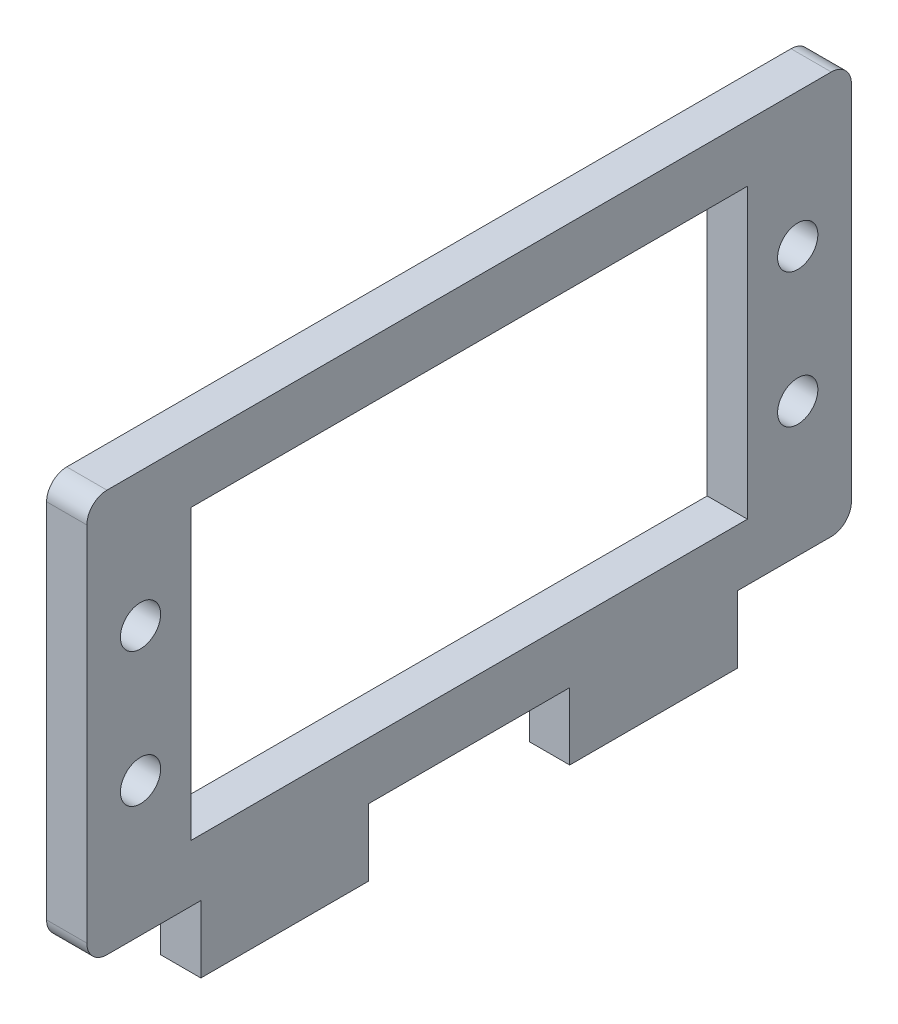
ISO-10303-21;
HEADER;
FILE_DESCRIPTION(('STEP AP214'),'2;1');
FILE_NAME('part.step','',(''),(''),'','','');
FILE_SCHEMA(('AUTOMOTIVE_DESIGN { 1 0 10303 214 1 1 1 1 }'));
ENDSEC;
DATA;
#1=APPLICATION_CONTEXT('core data for automotive mechanical design processes');
#2=APPLICATION_PROTOCOL_DEFINITION('international standard','automotive_design',2000,#1);
#3=PRODUCT_CONTEXT('',#1,'mechanical');
#4=PRODUCT('Part','Part','',(#3));
#5=PRODUCT_RELATED_PRODUCT_CATEGORY('part','',(#4));
#6=PRODUCT_DEFINITION_FORMATION('','',#4);
#7=PRODUCT_DEFINITION_CONTEXT('part definition',#1,'design');
#8=PRODUCT_DEFINITION('design','',#6,#7);
#9=PRODUCT_DEFINITION_SHAPE('','',#8);
#10=(LENGTH_UNIT() NAMED_UNIT(*) SI_UNIT(.MILLI.,.METRE.));
#11=(NAMED_UNIT(*) PLANE_ANGLE_UNIT() SI_UNIT($,.RADIAN.));
#12=(NAMED_UNIT(*) SI_UNIT($,.STERADIAN.) SOLID_ANGLE_UNIT());
#13=UNCERTAINTY_MEASURE_WITH_UNIT(LENGTH_MEASURE(1.E-05),#10,'distance_accuracy_value','');
#14=(GEOMETRIC_REPRESENTATION_CONTEXT(3) GLOBAL_UNCERTAINTY_ASSIGNED_CONTEXT((#13)) GLOBAL_UNIT_ASSIGNED_CONTEXT((#10,
#11,#12)) REPRESENTATION_CONTEXT('',''));
#15=CARTESIAN_POINT('',(0.,0.,0.));
#16=DIRECTION('',(0.,0.,1.));
#17=DIRECTION('',(1.,0.,0.));
#18=AXIS2_PLACEMENT_3D('',#15,#16,#17);
#19=CARTESIAN_POINT('',(3.,0.,0.));
#20=DIRECTION('',(1.,0.,0.));
#21=DIRECTION('',(0.,0.,-1.));
#22=AXIS2_PLACEMENT_3D('',#19,#20,#21);
#23=PLANE('',#22);
#24=CARTESIAN_POINT('',(3.,4.99999999999999,-24.5));
#25=DIRECTION('',(-1.,0.,0.));
#26=DIRECTION('',(0.,0.,1.));
#27=AXIS2_PLACEMENT_3D('',#24,#25,#26);
#28=CIRCLE('',#27,1.5);
#29=CARTESIAN_POINT('',(3.,4.99999999999999,-23.));
#30=VERTEX_POINT('',#29);
#31=EDGE_CURVE('E317',#30,#30,#28,.T.);
#32=ORIENTED_EDGE('',*,*,#31,.T.);
#33=EDGE_LOOP('',(#32));
#34=FACE_BOUND('',#33,.T.);
#35=DIRECTION('',(0.,1.,0.));
#36=VECTOR('',#35,1.);
#37=CARTESIAN_POINT('',(3.,0.,-20.75));
#38=LINE('',#37,#36);
#39=CARTESIAN_POINT('',(3.,10.75,-20.75));
#40=VERTEX_POINT('',#39);
#41=CARTESIAN_POINT('',(3.,-10.75,-20.75));
#42=VERTEX_POINT('',#41);
#43=EDGE_CURVE('E612',#40,#42,#38,.F.);
#44=ORIENTED_EDGE('',*,*,#43,.T.);
#45=DIRECTION('',(0.,0.,1.));
#46=VECTOR('',#45,1.);
#47=CARTESIAN_POINT('',(3.,-10.75,0.));
#48=LINE('',#47,#46);
#49=CARTESIAN_POINT('',(3.,-10.75,20.75));
#50=VERTEX_POINT('',#49);
#51=EDGE_CURVE('E615',#50,#42,#48,.F.);
#52=ORIENTED_EDGE('',*,*,#51,.F.);
#53=DIRECTION('',(0.,1.,0.));
#54=VECTOR('',#53,1.);
#55=CARTESIAN_POINT('',(3.,0.,20.75));
#56=LINE('',#55,#54);
#57=CARTESIAN_POINT('',(3.,10.75,20.75));
#58=VERTEX_POINT('',#57);
#59=EDGE_CURVE('E628',#58,#50,#56,.F.);
#60=ORIENTED_EDGE('',*,*,#59,.F.);
#61=DIRECTION('',(0.,0.,1.));
#62=VECTOR('',#61,1.);
#63=CARTESIAN_POINT('',(3.,10.75,0.));
#64=LINE('',#63,#62);
#65=EDGE_CURVE('E254',#58,#40,#64,.F.);
#66=ORIENTED_EDGE('',*,*,#65,.T.);
#67=EDGE_LOOP('',(#44,#52,#60,#66));
#68=FACE_BOUND('',#67,.T.);
#69=DIRECTION('',(0.,0.,1.));
#70=VECTOR('',#69,1.);
#71=CARTESIAN_POINT('',(3.,15.,0.));
#72=LINE('',#71,#70);
#73=CARTESIAN_POINT('',(3.,15.,27.));
#74=VERTEX_POINT('',#73);
#75=CARTESIAN_POINT('',(3.,15.,-27.));
#76=VERTEX_POINT('',#75);
#77=EDGE_CURVE('E267',#74,#76,#72,.F.);
#78=ORIENTED_EDGE('',*,*,#77,.F.);
#79=CARTESIAN_POINT('',(3.,13.5,27.));
#80=DIRECTION('',(1.,0.,0.));
#81=DIRECTION('',(0.,0.,-1.));
#82=AXIS2_PLACEMENT_3D('',#79,#80,#81);
#83=CIRCLE('',#82,1.5);
#84=CARTESIAN_POINT('',(3.,13.5,28.5));
#85=VERTEX_POINT('',#84);
#86=EDGE_CURVE('E322',#85,#74,#83,.F.);
#87=ORIENTED_EDGE('',*,*,#86,.F.);
#88=DIRECTION('',(0.,1.,0.));
#89=VECTOR('',#88,1.);
#90=CARTESIAN_POINT('',(3.,0.,28.5));
#91=LINE('',#90,#89);
#92=CARTESIAN_POINT('',(3.,-13.5,28.5));
#93=VERTEX_POINT('',#92);
#94=EDGE_CURVE('E262',#85,#93,#91,.F.);
#95=ORIENTED_EDGE('',*,*,#94,.T.);
#96=CARTESIAN_POINT('',(3.,-13.5,27.));
#97=DIRECTION('',(-1.,0.,0.));
#98=DIRECTION('',(0.,0.,1.));
#99=AXIS2_PLACEMENT_3D('',#96,#97,#98);
#100=CIRCLE('',#99,1.5);
#101=CARTESIAN_POINT('',(3.,-15.,27.));
#102=VERTEX_POINT('',#101);
#103=EDGE_CURVE('E265',#102,#93,#100,.T.);
#104=ORIENTED_EDGE('',*,*,#103,.F.);
#105=DIRECTION('',(0.,0.,1.));
#106=VECTOR('',#105,1.);
#107=CARTESIAN_POINT('',(3.,-15.,0.));
#108=LINE('',#107,#106);
#109=CARTESIAN_POINT('',(3.,-15.,20.));
#110=VERTEX_POINT('',#109);
#111=EDGE_CURVE('E251',#102,#110,#108,.F.);
#112=ORIENTED_EDGE('',*,*,#111,.T.);
#113=DIRECTION('',(0.,1.,0.));
#114=VECTOR('',#113,1.);
#115=CARTESIAN_POINT('',(3.,0.,20.));
#116=LINE('',#115,#114);
#117=CARTESIAN_POINT('',(3.,-20.,20.));
#118=VERTEX_POINT('',#117);
#119=EDGE_CURVE('E248',#110,#118,#116,.F.);
#120=ORIENTED_EDGE('',*,*,#119,.T.);
#121=DIRECTION('',(0.,0.,1.));
#122=VECTOR('',#121,1.);
#123=CARTESIAN_POINT('',(3.,-20.,0.));
#124=LINE('',#123,#122);
#125=CARTESIAN_POINT('',(3.,-20.,7.5));
#126=VERTEX_POINT('',#125);
#127=EDGE_CURVE('E247',#118,#126,#124,.F.);
#128=ORIENTED_EDGE('',*,*,#127,.T.);
#129=DIRECTION('',(0.,1.,0.));
#130=VECTOR('',#129,1.);
#131=CARTESIAN_POINT('',(3.,0.,7.49999999999999));
#132=LINE('',#131,#130);
#133=CARTESIAN_POINT('',(3.,-15.,7.49999999999999));
#134=VERTEX_POINT('',#133);
#135=EDGE_CURVE('E236',#134,#126,#132,.F.);
#136=ORIENTED_EDGE('',*,*,#135,.F.);
#137=DIRECTION('',(0.,0.,1.));
#138=VECTOR('',#137,1.);
#139=CARTESIAN_POINT('',(3.,-15.,0.));
#140=LINE('',#139,#138);
#141=CARTESIAN_POINT('',(3.,-15.,-7.5));
#142=VERTEX_POINT('',#141);
#143=EDGE_CURVE('E216',#134,#142,#140,.F.);
#144=ORIENTED_EDGE('',*,*,#143,.T.);
#145=DIRECTION('',(0.,1.,0.));
#146=VECTOR('',#145,1.);
#147=CARTESIAN_POINT('',(3.,0.,-7.49999999999999));
#148=LINE('',#147,#146);
#149=CARTESIAN_POINT('',(3.,-20.,-7.5));
#150=VERTEX_POINT('',#149);
#151=EDGE_CURVE('E215',#142,#150,#148,.F.);
#152=ORIENTED_EDGE('',*,*,#151,.T.);
#153=DIRECTION('',(0.,0.,-1.));
#154=VECTOR('',#153,1.);
#155=CARTESIAN_POINT('',(3.,-20.,0.));
#156=LINE('',#155,#154);
#157=CARTESIAN_POINT('',(3.,-20.,-20.));
#158=VERTEX_POINT('',#157);
#159=EDGE_CURVE('E204',#158,#150,#156,.F.);
#160=ORIENTED_EDGE('',*,*,#159,.F.);
#161=DIRECTION('',(0.,1.,0.));
#162=VECTOR('',#161,1.);
#163=CARTESIAN_POINT('',(3.,0.,-20.));
#164=LINE('',#163,#162);
#165=CARTESIAN_POINT('',(3.,-15.,-20.));
#166=VERTEX_POINT('',#165);
#167=EDGE_CURVE('E171',#166,#158,#164,.F.);
#168=ORIENTED_EDGE('',*,*,#167,.F.);
#169=DIRECTION('',(0.,0.,-1.));
#170=VECTOR('',#169,1.);
#171=CARTESIAN_POINT('',(3.,-15.,0.));
#172=LINE('',#171,#170);
#173=CARTESIAN_POINT('',(3.,-15.,-27.));
#174=VERTEX_POINT('',#173);
#175=EDGE_CURVE('E167',#174,#166,#172,.F.);
#176=ORIENTED_EDGE('',*,*,#175,.F.);
#177=CARTESIAN_POINT('',(3.,-13.5,-27.));
#178=DIRECTION('',(-1.,0.,0.));
#179=DIRECTION('',(0.,0.,1.));
#180=AXIS2_PLACEMENT_3D('',#177,#178,#179);
#181=CIRCLE('',#180,1.5);
#182=CARTESIAN_POINT('',(3.,-13.5,-28.5));
#183=VERTEX_POINT('',#182);
#184=EDGE_CURVE('E155',#183,#174,#181,.T.);
#185=ORIENTED_EDGE('',*,*,#184,.F.);
#186=DIRECTION('',(0.,1.,0.));
#187=VECTOR('',#186,1.);
#188=CARTESIAN_POINT('',(3.,0.,-28.5));
#189=LINE('',#188,#187);
#190=CARTESIAN_POINT('',(3.,13.5,-28.5));
#191=VERTEX_POINT('',#190);
#192=EDGE_CURVE('E150',#191,#183,#189,.F.);
#193=ORIENTED_EDGE('',*,*,#192,.F.);
#194=CARTESIAN_POINT('',(3.,13.5,-27.));
#195=DIRECTION('',(-1.,0.,0.));
#196=DIRECTION('',(0.,0.,1.));
#197=AXIS2_PLACEMENT_3D('',#194,#195,#196);
#198=CIRCLE('',#197,1.5);
#199=EDGE_CURVE('E325',#76,#191,#198,.T.);
#200=ORIENTED_EDGE('',*,*,#199,.F.);
#201=EDGE_LOOP('',(#78,#87,#95,#104,#112,#120,#128,#136,#144,#152,#160,#168,#176,#185,#193,#200));
#202=FACE_BOUND('',#201,.T.);
#203=CARTESIAN_POINT('',(3.,4.99999999999999,24.5));
#204=DIRECTION('',(-1.,0.,0.));
#205=DIRECTION('',(0.,0.,1.));
#206=AXIS2_PLACEMENT_3D('',#203,#204,#205);
#207=CIRCLE('',#206,1.5);
#208=CARTESIAN_POINT('',(3.,4.99999999999999,26.));
#209=VERTEX_POINT('',#208);
#210=EDGE_CURVE('E259',#209,#209,#207,.T.);
#211=ORIENTED_EDGE('',*,*,#210,.T.);
#212=EDGE_LOOP('',(#211));
#213=FACE_BOUND('',#212,.T.);
#214=CARTESIAN_POINT('',(3.,-5.00000000000001,24.5));
#215=DIRECTION('',(-1.,0.,0.));
#216=DIRECTION('',(0.,0.,1.));
#217=AXIS2_PLACEMENT_3D('',#214,#215,#216);
#218=CIRCLE('',#217,1.5);
#219=CARTESIAN_POINT('',(3.,-5.00000000000001,26.));
#220=VERTEX_POINT('',#219);
#221=EDGE_CURVE('E328',#220,#220,#218,.T.);
#222=ORIENTED_EDGE('',*,*,#221,.T.);
#223=EDGE_LOOP('',(#222));
#224=FACE_BOUND('',#223,.T.);
#225=CARTESIAN_POINT('',(3.,-5.00000000000001,-24.5));
#226=DIRECTION('',(-1.,0.,0.));
#227=DIRECTION('',(0.,0.,1.));
#228=AXIS2_PLACEMENT_3D('',#225,#226,#227);
#229=CIRCLE('',#228,1.5);
#230=CARTESIAN_POINT('',(3.,-5.00000000000001,-23.));
#231=VERTEX_POINT('',#230);
#232=EDGE_CURVE('E19',#231,#231,#229,.T.);
#233=ORIENTED_EDGE('',*,*,#232,.T.);
#234=EDGE_LOOP('',(#233));
#235=FACE_BOUND('',#234,.T.);
#236=ADVANCED_FACE('F16',(#34,#68,#202,#213,#224,#235),#23,.T.);
#237=CARTESIAN_POINT('',(3.,-5.00000000000001,-24.5));
#238=DIRECTION('',(-1.,0.,0.));
#239=DIRECTION('',(0.,0.,1.));
#240=AXIS2_PLACEMENT_3D('',#237,#238,#239);
#241=CYLINDRICAL_SURFACE('',#240,1.5);
#242=ORIENTED_EDGE('',*,*,#232,.F.);
#243=EDGE_LOOP('',(#242));
#244=FACE_BOUND('',#243,.T.);
#245=CARTESIAN_POINT('',(0.,-5.00000000000001,-24.5));
#246=DIRECTION('',(-1.,0.,0.));
#247=DIRECTION('',(0.,0.,1.));
#248=AXIS2_PLACEMENT_3D('',#245,#246,#247);
#249=CIRCLE('',#248,1.5);
#250=CARTESIAN_POINT('',(0.,-5.00000000000001,-23.));
#251=VERTEX_POINT('',#250);
#252=EDGE_CURVE('E314',#251,#251,#249,.T.);
#253=ORIENTED_EDGE('',*,*,#252,.T.);
#254=EDGE_LOOP('',(#253));
#255=FACE_BOUND('',#254,.T.);
#256=ADVANCED_FACE('F336',(#244,#255),#241,.F.);
#257=CARTESIAN_POINT('',(3.,-5.00000000000001,24.5));
#258=DIRECTION('',(-1.,0.,0.));
#259=DIRECTION('',(0.,0.,1.));
#260=AXIS2_PLACEMENT_3D('',#257,#258,#259);
#261=CYLINDRICAL_SURFACE('',#260,1.5);
#262=CARTESIAN_POINT('',(0.,-5.00000000000001,24.5));
#263=DIRECTION('',(-1.,0.,0.));
#264=DIRECTION('',(0.,0.,1.));
#265=AXIS2_PLACEMENT_3D('',#262,#263,#264);
#266=CIRCLE('',#265,1.5);
#267=CARTESIAN_POINT('',(0.,-5.00000000000001,26.));
#268=VERTEX_POINT('',#267);
#269=EDGE_CURVE('E311',#268,#268,#266,.T.);
#270=ORIENTED_EDGE('',*,*,#269,.T.);
#271=EDGE_LOOP('',(#270));
#272=FACE_BOUND('',#271,.T.);
#273=ORIENTED_EDGE('',*,*,#221,.F.);
#274=EDGE_LOOP('',(#273));
#275=FACE_BOUND('',#274,.T.);
#276=ADVANCED_FACE('F339',(#272,#275),#261,.F.);
#277=CARTESIAN_POINT('',(3.,4.99999999999999,24.5));
#278=DIRECTION('',(-1.,0.,0.));
#279=DIRECTION('',(0.,0.,1.));
#280=AXIS2_PLACEMENT_3D('',#277,#278,#279);
#281=CYLINDRICAL_SURFACE('',#280,1.5);
#282=CARTESIAN_POINT('',(0.,4.99999999999999,24.5));
#283=DIRECTION('',(-1.,0.,0.));
#284=DIRECTION('',(0.,0.,1.));
#285=AXIS2_PLACEMENT_3D('',#282,#283,#284);
#286=CIRCLE('',#285,1.5);
#287=CARTESIAN_POINT('',(0.,4.99999999999999,26.));
#288=VERTEX_POINT('',#287);
#289=EDGE_CURVE('E308',#288,#288,#286,.T.);
#290=ORIENTED_EDGE('',*,*,#289,.T.);
#291=EDGE_LOOP('',(#290));
#292=FACE_BOUND('',#291,.T.);
#293=ORIENTED_EDGE('',*,*,#210,.F.);
#294=EDGE_LOOP('',(#293));
#295=FACE_BOUND('',#294,.T.);
#296=ADVANCED_FACE('F429',(#292,#295),#281,.F.);
#297=CARTESIAN_POINT('',(3.,0.,20.));
#298=DIRECTION('',(0.,0.,-1.));
#299=DIRECTION('',(0.,1.,0.));
#300=AXIS2_PLACEMENT_3D('',#297,#298,#299);
#301=PLANE('',#300);
#302=DIRECTION('',(1.,0.,0.));
#303=VECTOR('',#302,1.);
#304=CARTESIAN_POINT('',(3.,-20.,20.));
#305=LINE('',#304,#303);
#306=CARTESIAN_POINT('',(0.,-20.,20.));
#307=VERTEX_POINT('',#306);
#308=EDGE_CURVE('E244',#307,#118,#305,.T.);
#309=ORIENTED_EDGE('',*,*,#308,.T.);
#310=ORIENTED_EDGE('',*,*,#119,.F.);
#311=DIRECTION('',(1.,0.,0.));
#312=VECTOR('',#311,1.);
#313=CARTESIAN_POINT('',(3.,-15.,20.));
#314=LINE('',#313,#312);
#315=CARTESIAN_POINT('',(0.,-15.,20.));
#316=VERTEX_POINT('',#315);
#317=EDGE_CURVE('E637',#110,#316,#314,.F.);
#318=ORIENTED_EDGE('',*,*,#317,.T.);
#319=DIRECTION('',(0.,1.,0.));
#320=VECTOR('',#319,1.);
#321=CARTESIAN_POINT('',(0.,0.,20.));
#322=LINE('',#321,#320);
#323=EDGE_CURVE('E241',#316,#307,#322,.F.);
#324=ORIENTED_EDGE('',*,*,#323,.T.);
#325=EDGE_LOOP('',(#309,#310,#318,#324));
#326=FACE_BOUND('',#325,.T.);
#327=ADVANCED_FACE('F425',(#326),#301,.F.);
#328=CARTESIAN_POINT('',(3.,-20.,0.));
#329=DIRECTION('',(0.,1.,0.));
#330=DIRECTION('',(0.,0.,1.));
#331=AXIS2_PLACEMENT_3D('',#328,#329,#330);
#332=PLANE('',#331);
#333=DIRECTION('',(1.,0.,0.));
#334=VECTOR('',#333,1.);
#335=CARTESIAN_POINT('',(3.,-20.,7.49999999999999));
#336=LINE('',#335,#334);
#337=CARTESIAN_POINT('',(0.,-20.,7.5));
#338=VERTEX_POINT('',#337);
#339=EDGE_CURVE('E227',#126,#338,#336,.F.);
#340=ORIENTED_EDGE('',*,*,#339,.F.);
#341=ORIENTED_EDGE('',*,*,#127,.F.);
#342=ORIENTED_EDGE('',*,*,#308,.F.);
#343=DIRECTION('',(0.,0.,-1.));
#344=VECTOR('',#343,1.);
#345=CARTESIAN_POINT('',(0.,-20.,0.));
#346=LINE('',#345,#344);
#347=EDGE_CURVE('E232',#307,#338,#346,.T.);
#348=ORIENTED_EDGE('',*,*,#347,.T.);
#349=EDGE_LOOP('',(#340,#341,#342,#348));
#350=FACE_BOUND('',#349,.T.);
#351=ADVANCED_FACE('F421',(#350),#332,.F.);
#352=CARTESIAN_POINT('',(3.,0.,7.49999999999999));
#353=DIRECTION('',(0.,0.,-1.));
#354=DIRECTION('',(0.,1.,0.));
#355=AXIS2_PLACEMENT_3D('',#352,#353,#354);
#356=PLANE('',#355);
#357=ORIENTED_EDGE('',*,*,#135,.T.);
#358=ORIENTED_EDGE('',*,*,#339,.T.);
#359=DIRECTION('',(0.,1.,0.));
#360=VECTOR('',#359,1.);
#361=CARTESIAN_POINT('',(0.,0.,7.49999999999999));
#362=LINE('',#361,#360);
#363=CARTESIAN_POINT('',(0.,-15.,7.5));
#364=VERTEX_POINT('',#363);
#365=EDGE_CURVE('E221',#338,#364,#362,.T.);
#366=ORIENTED_EDGE('',*,*,#365,.T.);
#367=DIRECTION('',(1.,0.,0.));
#368=VECTOR('',#367,1.);
#369=CARTESIAN_POINT('',(3.,-15.,7.49999999999999));
#370=LINE('',#369,#368);
#371=EDGE_CURVE('E224',#364,#134,#370,.T.);
#372=ORIENTED_EDGE('',*,*,#371,.T.);
#373=EDGE_LOOP('',(#357,#358,#366,#372));
#374=FACE_BOUND('',#373,.T.);
#375=ADVANCED_FACE('F417',(#374),#356,.T.);
#376=CARTESIAN_POINT('',(3.,-15.,0.));
#377=DIRECTION('',(0.,1.,0.));
#378=DIRECTION('',(0.,0.,1.));
#379=AXIS2_PLACEMENT_3D('',#376,#377,#378);
#380=PLANE('',#379);
#381=DIRECTION('',(1.,0.,0.));
#382=VECTOR('',#381,1.);
#383=CARTESIAN_POINT('',(3.,-15.,-7.5));
#384=LINE('',#383,#382);
#385=CARTESIAN_POINT('',(0.,-15.,-7.5));
#386=VERTEX_POINT('',#385);
#387=EDGE_CURVE('E212',#386,#142,#384,.T.);
#388=ORIENTED_EDGE('',*,*,#387,.T.);
#389=ORIENTED_EDGE('',*,*,#143,.F.);
#390=ORIENTED_EDGE('',*,*,#371,.F.);
#391=DIRECTION('',(0.,0.,-1.));
#392=VECTOR('',#391,1.);
#393=CARTESIAN_POINT('',(0.,-15.,0.));
#394=LINE('',#393,#392);
#395=EDGE_CURVE('E209',#364,#386,#394,.T.);
#396=ORIENTED_EDGE('',*,*,#395,.T.);
#397=EDGE_LOOP('',(#388,#389,#390,#396));
#398=FACE_BOUND('',#397,.T.);
#399=ADVANCED_FACE('F413',(#398),#380,.F.);
#400=CARTESIAN_POINT('',(3.,0.,-7.49999999999999));
#401=DIRECTION('',(0.,0.,-1.));
#402=DIRECTION('',(0.,1.,0.));
#403=AXIS2_PLACEMENT_3D('',#400,#401,#402);
#404=PLANE('',#403);
#405=DIRECTION('',(1.,0.,0.));
#406=VECTOR('',#405,1.);
#407=CARTESIAN_POINT('',(3.,-20.,-7.5));
#408=LINE('',#407,#406);
#409=CARTESIAN_POINT('',(0.,-20.,-7.5));
#410=VERTEX_POINT('',#409);
#411=EDGE_CURVE('E202',#150,#410,#408,.F.);
#412=ORIENTED_EDGE('',*,*,#411,.F.);
#413=ORIENTED_EDGE('',*,*,#151,.F.);
#414=ORIENTED_EDGE('',*,*,#387,.F.);
#415=DIRECTION('',(0.,1.,0.));
#416=VECTOR('',#415,1.);
#417=CARTESIAN_POINT('',(0.,0.,-7.5));
#418=LINE('',#417,#416);
#419=EDGE_CURVE('E199',#386,#410,#418,.F.);
#420=ORIENTED_EDGE('',*,*,#419,.T.);
#421=EDGE_LOOP('',(#412,#413,#414,#420));
#422=FACE_BOUND('',#421,.T.);
#423=ADVANCED_FACE('F409',(#422),#404,.F.);
#424=CARTESIAN_POINT('',(3.,-20.,0.));
#425=DIRECTION('',(0.,-1.,0.));
#426=DIRECTION('',(0.,0.,-1.));
#427=AXIS2_PLACEMENT_3D('',#424,#425,#426);
#428=PLANE('',#427);
#429=ORIENTED_EDGE('',*,*,#159,.T.);
#430=ORIENTED_EDGE('',*,*,#411,.T.);
#431=DIRECTION('',(0.,0.,-1.));
#432=VECTOR('',#431,1.);
#433=CARTESIAN_POINT('',(0.,-20.,0.));
#434=LINE('',#433,#432);
#435=CARTESIAN_POINT('',(0.,-20.,-20.));
#436=VERTEX_POINT('',#435);
#437=EDGE_CURVE('E191',#410,#436,#434,.T.);
#438=ORIENTED_EDGE('',*,*,#437,.T.);
#439=DIRECTION('',(1.,0.,0.));
#440=VECTOR('',#439,1.);
#441=CARTESIAN_POINT('',(3.,-20.,-20.));
#442=LINE('',#441,#440);
#443=EDGE_CURVE('E174',#158,#436,#442,.F.);
#444=ORIENTED_EDGE('',*,*,#443,.F.);
#445=EDGE_LOOP('',(#429,#430,#438,#444));
#446=FACE_BOUND('',#445,.T.);
#447=ADVANCED_FACE('F405',(#446),#428,.T.);
#448=CARTESIAN_POINT('',(3.,0.,-20.));
#449=DIRECTION('',(0.,0.,-1.));
#450=DIRECTION('',(0.,1.,0.));
#451=AXIS2_PLACEMENT_3D('',#448,#449,#450);
#452=PLANE('',#451);
#453=ORIENTED_EDGE('',*,*,#167,.T.);
#454=ORIENTED_EDGE('',*,*,#443,.T.);
#455=DIRECTION('',(0.,1.,0.));
#456=VECTOR('',#455,1.);
#457=CARTESIAN_POINT('',(0.,0.,-20.));
#458=LINE('',#457,#456);
#459=CARTESIAN_POINT('',(0.,-15.,-20.));
#460=VERTEX_POINT('',#459);
#461=EDGE_CURVE('E188',#436,#460,#458,.T.);
#462=ORIENTED_EDGE('',*,*,#461,.T.);
#463=DIRECTION('',(1.,0.,0.));
#464=VECTOR('',#463,1.);
#465=CARTESIAN_POINT('',(3.,-15.,-20.));
#466=LINE('',#465,#464);
#467=EDGE_CURVE('E164',#166,#460,#466,.F.);
#468=ORIENTED_EDGE('',*,*,#467,.F.);
#469=EDGE_LOOP('',(#453,#454,#462,#468));
#470=FACE_BOUND('',#469,.T.);
#471=ADVANCED_FACE('F402',(#470),#452,.T.);
#472=CARTESIAN_POINT('',(3.,-15.,0.));
#473=DIRECTION('',(0.,-1.,0.));
#474=DIRECTION('',(0.,0.,-1.));
#475=AXIS2_PLACEMENT_3D('',#472,#473,#474);
#476=PLANE('',#475);
#477=ORIENTED_EDGE('',*,*,#175,.T.);
#478=ORIENTED_EDGE('',*,*,#467,.T.);
#479=DIRECTION('',(0.,0.,-1.));
#480=VECTOR('',#479,1.);
#481=CARTESIAN_POINT('',(0.,-15.,0.));
#482=LINE('',#481,#480);
#483=CARTESIAN_POINT('',(0.,-15.,-27.));
#484=VERTEX_POINT('',#483);
#485=EDGE_CURVE('E179',#460,#484,#482,.T.);
#486=ORIENTED_EDGE('',*,*,#485,.T.);
#487=DIRECTION('',(-1.,0.,0.));
#488=VECTOR('',#487,1.);
#489=CARTESIAN_POINT('',(3.,-15.,-27.));
#490=LINE('',#489,#488);
#491=EDGE_CURVE('E160',#174,#484,#490,.T.);
#492=ORIENTED_EDGE('',*,*,#491,.F.);
#493=EDGE_LOOP('',(#477,#478,#486,#492));
#494=FACE_BOUND('',#493,.T.);
#495=ADVANCED_FACE('F177',(#494),#476,.T.);
#496=CARTESIAN_POINT('',(3.,-13.5,-27.));
#497=DIRECTION('',(-1.,0.,0.));
#498=DIRECTION('',(0.,0.,1.));
#499=AXIS2_PLACEMENT_3D('',#496,#497,#498);
#500=CYLINDRICAL_SURFACE('',#499,1.5);
#501=CARTESIAN_POINT('',(0.,-13.5,-27.));
#502=DIRECTION('',(-1.,0.,0.));
#503=DIRECTION('',(0.,0.,1.));
#504=AXIS2_PLACEMENT_3D('',#501,#502,#503);
#505=CIRCLE('',#504,1.5);
#506=CARTESIAN_POINT('',(0.,-13.5,-28.5));
#507=VERTEX_POINT('',#506);
#508=EDGE_CURVE('E306',#484,#507,#505,.F.);
#509=ORIENTED_EDGE('',*,*,#508,.T.);
#510=DIRECTION('',(1.,0.,0.));
#511=VECTOR('',#510,1.);
#512=CARTESIAN_POINT('',(3.,-13.5,-28.5));
#513=LINE('',#512,#511);
#514=EDGE_CURVE('E162',#183,#507,#513,.F.);
#515=ORIENTED_EDGE('',*,*,#514,.F.);
#516=ORIENTED_EDGE('',*,*,#184,.T.);
#517=ORIENTED_EDGE('',*,*,#491,.T.);
#518=EDGE_LOOP('',(#509,#515,#516,#517));
#519=FACE_BOUND('',#518,.T.);
#520=ADVANCED_FACE('F158',(#519),#500,.T.);
#521=CARTESIAN_POINT('',(3.,0.,-28.5));
#522=DIRECTION('',(0.,0.,-1.));
#523=DIRECTION('',(0.,1.,0.));
#524=AXIS2_PLACEMENT_3D('',#521,#522,#523);
#525=PLANE('',#524);
#526=DIRECTION('',(0.,1.,0.));
#527=VECTOR('',#526,1.);
#528=CARTESIAN_POINT('',(0.,0.,-28.5));
#529=LINE('',#528,#527);
#530=CARTESIAN_POINT('',(0.,13.5,-28.5));
#531=VERTEX_POINT('',#530);
#532=EDGE_CURVE('E305',#507,#531,#529,.T.);
#533=ORIENTED_EDGE('',*,*,#532,.T.);
#534=DIRECTION('',(-1.,0.,0.));
#535=VECTOR('',#534,1.);
#536=CARTESIAN_POINT('',(3.,13.5,-28.5));
#537=LINE('',#536,#535);
#538=EDGE_CURVE('E269',#191,#531,#537,.T.);
#539=ORIENTED_EDGE('',*,*,#538,.F.);
#540=ORIENTED_EDGE('',*,*,#192,.T.);
#541=ORIENTED_EDGE('',*,*,#514,.T.);
#542=EDGE_LOOP('',(#533,#539,#540,#541));
#543=FACE_BOUND('',#542,.T.);
#544=ADVANCED_FACE('F394',(#543),#525,.T.);
#545=CARTESIAN_POINT('',(3.,13.5,-27.));
#546=DIRECTION('',(-1.,0.,0.));
#547=DIRECTION('',(0.,0.,1.));
#548=AXIS2_PLACEMENT_3D('',#545,#546,#547);
#549=CYLINDRICAL_SURFACE('',#548,1.5);
#550=CARTESIAN_POINT('',(0.,13.5,-27.));
#551=DIRECTION('',(-1.,0.,0.));
#552=DIRECTION('',(0.,0.,1.));
#553=AXIS2_PLACEMENT_3D('',#550,#551,#552);
#554=CIRCLE('',#553,1.5);
#555=CARTESIAN_POINT('',(0.,15.,-27.));
#556=VERTEX_POINT('',#555);
#557=EDGE_CURVE('E302',#531,#556,#554,.F.);
#558=ORIENTED_EDGE('',*,*,#557,.T.);
#559=DIRECTION('',(1.,0.,0.));
#560=VECTOR('',#559,1.);
#561=CARTESIAN_POINT('',(3.,15.,-27.));
#562=LINE('',#561,#560);
#563=EDGE_CURVE('E268',#76,#556,#562,.F.);
#564=ORIENTED_EDGE('',*,*,#563,.F.);
#565=ORIENTED_EDGE('',*,*,#199,.T.);
#566=ORIENTED_EDGE('',*,*,#538,.T.);
#567=EDGE_LOOP('',(#558,#564,#565,#566));
#568=FACE_BOUND('',#567,.T.);
#569=ADVANCED_FACE('F390',(#568),#549,.T.);
#570=CARTESIAN_POINT('',(3.,15.,0.));
#571=DIRECTION('',(0.,1.,0.));
#572=DIRECTION('',(0.,0.,1.));
#573=AXIS2_PLACEMENT_3D('',#570,#571,#572);
#574=PLANE('',#573);
#575=ORIENTED_EDGE('',*,*,#77,.T.);
#576=ORIENTED_EDGE('',*,*,#563,.T.);
#577=DIRECTION('',(0.,0.,-1.));
#578=VECTOR('',#577,1.);
#579=CARTESIAN_POINT('',(0.,15.,0.));
#580=LINE('',#579,#578);
#581=CARTESIAN_POINT('',(0.,15.,27.));
#582=VERTEX_POINT('',#581);
#583=EDGE_CURVE('E301',#556,#582,#580,.F.);
#584=ORIENTED_EDGE('',*,*,#583,.T.);
#585=DIRECTION('',(1.,0.,0.));
#586=VECTOR('',#585,1.);
#587=CARTESIAN_POINT('',(3.,15.,27.));
#588=LINE('',#587,#586);
#589=EDGE_CURVE('E324',#74,#582,#588,.F.);
#590=ORIENTED_EDGE('',*,*,#589,.F.);
#591=EDGE_LOOP('',(#575,#576,#584,#590));
#592=FACE_BOUND('',#591,.T.);
#593=ADVANCED_FACE('F386',(#592),#574,.T.);
#594=CARTESIAN_POINT('',(3.,13.5,27.));
#595=DIRECTION('',(1.,0.,0.));
#596=DIRECTION('',(0.,0.,-1.));
#597=AXIS2_PLACEMENT_3D('',#594,#595,#596);
#598=CYLINDRICAL_SURFACE('',#597,1.5);
#599=CARTESIAN_POINT('',(0.,13.5,27.));
#600=DIRECTION('',(1.,0.,0.));
#601=DIRECTION('',(0.,0.,-1.));
#602=AXIS2_PLACEMENT_3D('',#599,#600,#601);
#603=CIRCLE('',#602,1.5);
#604=CARTESIAN_POINT('',(0.,13.5,28.5));
#605=VERTEX_POINT('',#604);
#606=EDGE_CURVE('E298',#582,#605,#603,.T.);
#607=ORIENTED_EDGE('',*,*,#606,.T.);
#608=DIRECTION('',(1.,0.,0.));
#609=VECTOR('',#608,1.);
#610=CARTESIAN_POINT('',(3.,13.5,28.5));
#611=LINE('',#610,#609);
#612=EDGE_CURVE('E266',#605,#85,#611,.T.);
#613=ORIENTED_EDGE('',*,*,#612,.T.);
#614=ORIENTED_EDGE('',*,*,#86,.T.);
#615=ORIENTED_EDGE('',*,*,#589,.T.);
#616=EDGE_LOOP('',(#607,#613,#614,#615));
#617=FACE_BOUND('',#616,.T.);
#618=ADVANCED_FACE('F382',(#617),#598,.T.);
#619=CARTESIAN_POINT('',(3.,0.,28.5));
#620=DIRECTION('',(0.,0.,-1.));
#621=DIRECTION('',(0.,1.,0.));
#622=AXIS2_PLACEMENT_3D('',#619,#620,#621);
#623=PLANE('',#622);
#624=DIRECTION('',(-1.,0.,0.));
#625=VECTOR('',#624,1.);
#626=CARTESIAN_POINT('',(3.,-13.5,28.5));
#627=LINE('',#626,#625);
#628=CARTESIAN_POINT('',(0.,-13.5,28.5));
#629=VERTEX_POINT('',#628);
#630=EDGE_CURVE('E321',#93,#629,#627,.T.);
#631=ORIENTED_EDGE('',*,*,#630,.F.);
#632=ORIENTED_EDGE('',*,*,#94,.F.);
#633=ORIENTED_EDGE('',*,*,#612,.F.);
#634=DIRECTION('',(0.,1.,0.));
#635=VECTOR('',#634,1.);
#636=CARTESIAN_POINT('',(0.,0.,28.5));
#637=LINE('',#636,#635);
#638=EDGE_CURVE('E297',#605,#629,#637,.F.);
#639=ORIENTED_EDGE('',*,*,#638,.T.);
#640=EDGE_LOOP('',(#631,#632,#633,#639));
#641=FACE_BOUND('',#640,.T.);
#642=ADVANCED_FACE('F378',(#641),#623,.F.);
#643=CARTESIAN_POINT('',(3.,-13.5,27.));
#644=DIRECTION('',(-1.,0.,0.));
#645=DIRECTION('',(0.,0.,1.));
#646=AXIS2_PLACEMENT_3D('',#643,#644,#645);
#647=CYLINDRICAL_SURFACE('',#646,1.5);
#648=CARTESIAN_POINT('',(0.,-13.5,27.));
#649=DIRECTION('',(-1.,0.,0.));
#650=DIRECTION('',(0.,0.,1.));
#651=AXIS2_PLACEMENT_3D('',#648,#649,#650);
#652=CIRCLE('',#651,1.5);
#653=CARTESIAN_POINT('',(0.,-15.,27.));
#654=VERTEX_POINT('',#653);
#655=EDGE_CURVE('E293',#629,#654,#652,.F.);
#656=ORIENTED_EDGE('',*,*,#655,.T.);
#657=DIRECTION('',(1.,0.,0.));
#658=VECTOR('',#657,1.);
#659=CARTESIAN_POINT('',(3.,-15.,27.));
#660=LINE('',#659,#658);
#661=EDGE_CURVE('E255',#654,#102,#660,.T.);
#662=ORIENTED_EDGE('',*,*,#661,.T.);
#663=ORIENTED_EDGE('',*,*,#103,.T.);
#664=ORIENTED_EDGE('',*,*,#630,.T.);
#665=EDGE_LOOP('',(#656,#662,#663,#664));
#666=FACE_BOUND('',#665,.T.);
#667=ADVANCED_FACE('F374',(#666),#647,.T.);
#668=CARTESIAN_POINT('',(3.,-15.,0.));
#669=DIRECTION('',(0.,1.,0.));
#670=DIRECTION('',(0.,0.,1.));
#671=AXIS2_PLACEMENT_3D('',#668,#669,#670);
#672=PLANE('',#671);
#673=ORIENTED_EDGE('',*,*,#661,.F.);
#674=DIRECTION('',(0.,0.,-1.));
#675=VECTOR('',#674,1.);
#676=CARTESIAN_POINT('',(0.,-15.,0.));
#677=LINE('',#676,#675);
#678=EDGE_CURVE('E296',#654,#316,#677,.T.);
#679=ORIENTED_EDGE('',*,*,#678,.T.);
#680=ORIENTED_EDGE('',*,*,#317,.F.);
#681=ORIENTED_EDGE('',*,*,#111,.F.);
#682=EDGE_LOOP('',(#673,#679,#680,#681));
#683=FACE_BOUND('',#682,.T.);
#684=ADVANCED_FACE('F370',(#683),#672,.F.);
#685=CARTESIAN_POINT('',(3.,10.75,0.));
#686=DIRECTION('',(0.,1.,0.));
#687=DIRECTION('',(0.,0.,1.));
#688=AXIS2_PLACEMENT_3D('',#685,#686,#687);
#689=PLANE('',#688);
#690=DIRECTION('',(1.,0.,0.));
#691=VECTOR('',#690,1.);
#692=CARTESIAN_POINT('',(3.,10.75,-20.75));
#693=LINE('',#692,#691);
#694=CARTESIAN_POINT('',(0.,10.75,-20.75));
#695=VERTEX_POINT('',#694);
#696=EDGE_CURVE('E617',#695,#40,#693,.T.);
#697=ORIENTED_EDGE('',*,*,#696,.T.);
#698=ORIENTED_EDGE('',*,*,#65,.F.);
#699=DIRECTION('',(1.,0.,0.));
#700=VECTOR('',#699,1.);
#701=CARTESIAN_POINT('',(3.,10.75,20.75));
#702=LINE('',#701,#700);
#703=CARTESIAN_POINT('',(0.,10.75,20.75));
#704=VERTEX_POINT('',#703);
#705=EDGE_CURVE('E625',#704,#58,#702,.T.);
#706=ORIENTED_EDGE('',*,*,#705,.F.);
#707=DIRECTION('',(0.,0.,-1.));
#708=VECTOR('',#707,1.);
#709=CARTESIAN_POINT('',(0.,10.75,0.));
#710=LINE('',#709,#708);
#711=EDGE_CURVE('E670',#704,#695,#710,.T.);
#712=ORIENTED_EDGE('',*,*,#711,.T.);
#713=EDGE_LOOP('',(#697,#698,#706,#712));
#714=FACE_BOUND('',#713,.T.);
#715=ADVANCED_FACE('F366',(#714),#689,.F.);
#716=CARTESIAN_POINT('',(3.,0.,-20.75));
#717=DIRECTION('',(0.,0.,-1.));
#718=DIRECTION('',(0.,1.,0.));
#719=AXIS2_PLACEMENT_3D('',#716,#717,#718);
#720=PLANE('',#719);
#721=DIRECTION('',(1.,0.,0.));
#722=VECTOR('',#721,1.);
#723=CARTESIAN_POINT('',(3.,-10.75,-20.75));
#724=LINE('',#723,#722);
#725=CARTESIAN_POINT('',(0.,-10.75,-20.75));
#726=VERTEX_POINT('',#725);
#727=EDGE_CURVE('E620',#42,#726,#724,.F.);
#728=ORIENTED_EDGE('',*,*,#727,.F.);
#729=ORIENTED_EDGE('',*,*,#43,.F.);
#730=ORIENTED_EDGE('',*,*,#696,.F.);
#731=DIRECTION('',(0.,1.,0.));
#732=VECTOR('',#731,1.);
#733=CARTESIAN_POINT('',(0.,0.,-20.75));
#734=LINE('',#733,#732);
#735=EDGE_CURVE('E622',#695,#726,#734,.F.);
#736=ORIENTED_EDGE('',*,*,#735,.T.);
#737=EDGE_LOOP('',(#728,#729,#730,#736));
#738=FACE_BOUND('',#737,.T.);
#739=ADVANCED_FACE('F362',(#738),#720,.F.);
#740=CARTESIAN_POINT('',(3.,-10.75,0.));
#741=DIRECTION('',(0.,1.,0.));
#742=DIRECTION('',(0.,0.,1.));
#743=AXIS2_PLACEMENT_3D('',#740,#741,#742);
#744=PLANE('',#743);
#745=ORIENTED_EDGE('',*,*,#51,.T.);
#746=ORIENTED_EDGE('',*,*,#727,.T.);
#747=DIRECTION('',(0.,0.,-1.));
#748=VECTOR('',#747,1.);
#749=CARTESIAN_POINT('',(0.,-10.75,0.));
#750=LINE('',#749,#748);
#751=CARTESIAN_POINT('',(0.,-10.75,20.75));
#752=VERTEX_POINT('',#751);
#753=EDGE_CURVE('E671',#726,#752,#750,.F.);
#754=ORIENTED_EDGE('',*,*,#753,.T.);
#755=DIRECTION('',(1.,0.,0.));
#756=VECTOR('',#755,1.);
#757=CARTESIAN_POINT('',(3.,-10.75,20.75));
#758=LINE('',#757,#756);
#759=EDGE_CURVE('E34',#50,#752,#758,.F.);
#760=ORIENTED_EDGE('',*,*,#759,.F.);
#761=EDGE_LOOP('',(#745,#746,#754,#760));
#762=FACE_BOUND('',#761,.T.);
#763=ADVANCED_FACE('F359',(#762),#744,.T.);
#764=CARTESIAN_POINT('',(3.,0.,20.75));
#765=DIRECTION('',(0.,0.,-1.));
#766=DIRECTION('',(0.,1.,0.));
#767=AXIS2_PLACEMENT_3D('',#764,#765,#766);
#768=PLANE('',#767);
#769=ORIENTED_EDGE('',*,*,#59,.T.);
#770=ORIENTED_EDGE('',*,*,#759,.T.);
#771=DIRECTION('',(0.,1.,0.));
#772=VECTOR('',#771,1.);
#773=CARTESIAN_POINT('',(0.,0.,20.75));
#774=LINE('',#773,#772);
#775=EDGE_CURVE('E25',#752,#704,#774,.T.);
#776=ORIENTED_EDGE('',*,*,#775,.T.);
#777=ORIENTED_EDGE('',*,*,#705,.T.);
#778=EDGE_LOOP('',(#769,#770,#776,#777));
#779=FACE_BOUND('',#778,.T.);
#780=ADVANCED_FACE('F351',(#779),#768,.T.);
#781=CARTESIAN_POINT('',(3.,4.99999999999999,-24.5));
#782=DIRECTION('',(-1.,0.,0.));
#783=DIRECTION('',(0.,0.,1.));
#784=AXIS2_PLACEMENT_3D('',#781,#782,#783);
#785=CYLINDRICAL_SURFACE('',#784,1.5);
#786=ORIENTED_EDGE('',*,*,#31,.F.);
#787=EDGE_LOOP('',(#786));
#788=FACE_BOUND('',#787,.T.);
#789=CARTESIAN_POINT('',(0.,4.99999999999999,-24.5));
#790=DIRECTION('',(-1.,0.,0.));
#791=DIRECTION('',(0.,0.,1.));
#792=AXIS2_PLACEMENT_3D('',#789,#790,#791);
#793=CIRCLE('',#792,1.5);
#794=CARTESIAN_POINT('',(0.,4.99999999999999,-23.));
#795=VERTEX_POINT('',#794);
#796=EDGE_CURVE('E11',#795,#795,#793,.T.);
#797=ORIENTED_EDGE('',*,*,#796,.T.);
#798=EDGE_LOOP('',(#797));
#799=FACE_BOUND('',#798,.T.);
#800=ADVANCED_FACE('F344',(#788,#799),#785,.F.);
#801=CARTESIAN_POINT('',(0.,0.,0.));
#802=DIRECTION('',(1.,0.,0.));
#803=DIRECTION('',(0.,0.,-1.));
#804=AXIS2_PLACEMENT_3D('',#801,#802,#803);
#805=PLANE('',#804);
#806=ORIENTED_EDGE('',*,*,#796,.F.);
#807=EDGE_LOOP('',(#806));
#808=FACE_BOUND('',#807,.T.);
#809=ORIENTED_EDGE('',*,*,#753,.F.);
#810=ORIENTED_EDGE('',*,*,#735,.F.);
#811=ORIENTED_EDGE('',*,*,#711,.F.);
#812=ORIENTED_EDGE('',*,*,#775,.F.);
#813=EDGE_LOOP('',(#809,#810,#811,#812));
#814=FACE_BOUND('',#813,.T.);
#815=ORIENTED_EDGE('',*,*,#655,.F.);
#816=ORIENTED_EDGE('',*,*,#638,.F.);
#817=ORIENTED_EDGE('',*,*,#606,.F.);
#818=ORIENTED_EDGE('',*,*,#583,.F.);
#819=ORIENTED_EDGE('',*,*,#557,.F.);
#820=ORIENTED_EDGE('',*,*,#532,.F.);
#821=ORIENTED_EDGE('',*,*,#508,.F.);
#822=ORIENTED_EDGE('',*,*,#485,.F.);
#823=ORIENTED_EDGE('',*,*,#461,.F.);
#824=ORIENTED_EDGE('',*,*,#437,.F.);
#825=ORIENTED_EDGE('',*,*,#419,.F.);
#826=ORIENTED_EDGE('',*,*,#395,.F.);
#827=ORIENTED_EDGE('',*,*,#365,.F.);
#828=ORIENTED_EDGE('',*,*,#347,.F.);
#829=ORIENTED_EDGE('',*,*,#323,.F.);
#830=ORIENTED_EDGE('',*,*,#678,.F.);
#831=EDGE_LOOP('',(#815,#816,#817,#818,#819,#820,#821,#822,#823,#824,#825,#826,#827,#828,#829,#830));
#832=FACE_BOUND('',#831,.T.);
#833=ORIENTED_EDGE('',*,*,#289,.F.);
#834=EDGE_LOOP('',(#833));
#835=FACE_BOUND('',#834,.T.);
#836=ORIENTED_EDGE('',*,*,#269,.F.);
#837=EDGE_LOOP('',(#836));
#838=FACE_BOUND('',#837,.T.);
#839=ORIENTED_EDGE('',*,*,#252,.F.);
#840=EDGE_LOOP('',(#839));
#841=FACE_BOUND('',#840,.T.);
#842=ADVANCED_FACE('F342',(#808,#814,#832,#835,#838,#841),#805,.F.);
#843=CLOSED_SHELL('',(#236,#256,#276,#296,#327,#351,#375,#399,#423,#447,#471,#495,#520,#544,
#569,#593,#618,#642,#667,#684,#715,#739,#763,#780,#800,#842));
#844=MANIFOLD_SOLID_BREP('B1',#843);
#845=ADVANCED_BREP_SHAPE_REPRESENTATION('',(#18,#844),#14);
#846=SHAPE_DEFINITION_REPRESENTATION(#9,#845);
ENDSEC;
END-ISO-10303-21;
